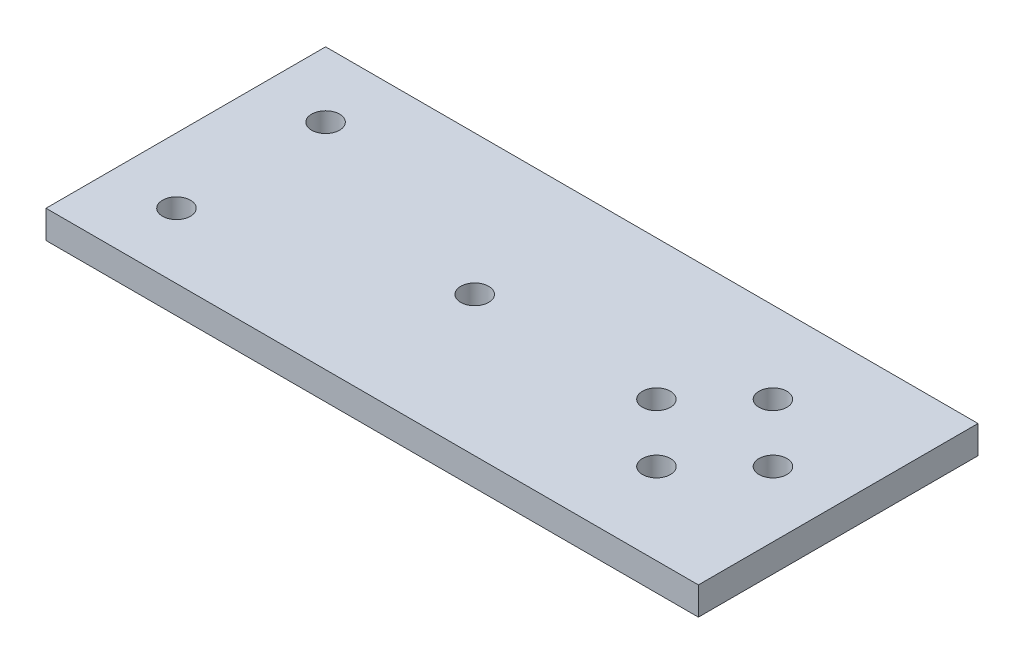
ISO-10303-21;
HEADER;
FILE_DESCRIPTION(('STEP AP214'),'2;1');
FILE_NAME('part.step','',(''),(''),'','','');
FILE_SCHEMA(('AUTOMOTIVE_DESIGN { 1 0 10303 214 1 1 1 1 }'));
ENDSEC;
DATA;
#1=APPLICATION_CONTEXT('core data for automotive mechanical design processes');
#2=APPLICATION_PROTOCOL_DEFINITION('international standard','automotive_design',2000,#1);
#3=PRODUCT_CONTEXT('',#1,'mechanical');
#4=PRODUCT('Part','Part','',(#3));
#5=PRODUCT_RELATED_PRODUCT_CATEGORY('part','',(#4));
#6=PRODUCT_DEFINITION_FORMATION('','',#4);
#7=PRODUCT_DEFINITION_CONTEXT('part definition',#1,'design');
#8=PRODUCT_DEFINITION('design','',#6,#7);
#9=PRODUCT_DEFINITION_SHAPE('','',#8);
#10=(LENGTH_UNIT() NAMED_UNIT(*) SI_UNIT(.MILLI.,.METRE.));
#11=(NAMED_UNIT(*) PLANE_ANGLE_UNIT() SI_UNIT($,.RADIAN.));
#12=(NAMED_UNIT(*) SI_UNIT($,.STERADIAN.) SOLID_ANGLE_UNIT());
#13=UNCERTAINTY_MEASURE_WITH_UNIT(LENGTH_MEASURE(1.E-05),#10,'distance_accuracy_value','');
#14=(GEOMETRIC_REPRESENTATION_CONTEXT(3) GLOBAL_UNCERTAINTY_ASSIGNED_CONTEXT((#13)) GLOBAL_UNIT_ASSIGNED_CONTEXT((#10,
#11,#12)) REPRESENTATION_CONTEXT('',''));
#15=CARTESIAN_POINT('',(0.,0.,0.));
#16=DIRECTION('',(0.,0.,1.));
#17=DIRECTION('',(1.,0.,0.));
#18=AXIS2_PLACEMENT_3D('',#15,#16,#17);
#19=CARTESIAN_POINT('',(35.,-3.,-15.));
#20=DIRECTION('',(1.,0.,0.));
#21=DIRECTION('',(0.,0.,-1.));
#22=AXIS2_PLACEMENT_3D('',#19,#20,#21);
#23=PLANE('',#22);
#24=DIRECTION('',(0.,0.,-1.));
#25=VECTOR('',#24,1.);
#26=CARTESIAN_POINT('',(35.,0.,-15.));
#27=LINE('',#26,#25);
#28=CARTESIAN_POINT('',(35.,0.,15.));
#29=VERTEX_POINT('',#28);
#30=CARTESIAN_POINT('',(35.,0.,-15.));
#31=VERTEX_POINT('',#30);
#32=EDGE_CURVE('E103',#29,#31,#27,.T.);
#33=ORIENTED_EDGE('',*,*,#32,.F.);
#34=DIRECTION('',(0.,1.,0.));
#35=VECTOR('',#34,1.);
#36=CARTESIAN_POINT('',(35.,-3.,15.));
#37=LINE('',#36,#35);
#38=CARTESIAN_POINT('',(35.,-3.,15.));
#39=VERTEX_POINT('',#38);
#40=EDGE_CURVE('E11',#39,#29,#37,.T.);
#41=ORIENTED_EDGE('',*,*,#40,.F.);
#42=DIRECTION('',(0.,0.,-1.));
#43=VECTOR('',#42,1.);
#44=CARTESIAN_POINT('',(35.,-3.,-15.));
#45=LINE('',#44,#43);
#46=CARTESIAN_POINT('',(35.,-3.,-15.));
#47=VERTEX_POINT('',#46);
#48=EDGE_CURVE('E96',#39,#47,#45,.T.);
#49=ORIENTED_EDGE('',*,*,#48,.T.);
#50=DIRECTION('',(0.,1.,0.));
#51=VECTOR('',#50,1.);
#52=CARTESIAN_POINT('',(35.,-3.,-15.));
#53=LINE('',#52,#51);
#54=EDGE_CURVE('E41',#47,#31,#53,.T.);
#55=ORIENTED_EDGE('',*,*,#54,.T.);
#56=EDGE_LOOP('',(#33,#41,#49,#55));
#57=FACE_BOUND('',#56,.T.);
#58=ADVANCED_FACE('F38',(#57),#23,.T.);
#59=CARTESIAN_POINT('',(-35.,-3.,15.));
#60=DIRECTION('',(0.,0.,1.));
#61=DIRECTION('',(1.,0.,0.));
#62=AXIS2_PLACEMENT_3D('',#59,#60,#61);
#63=PLANE('',#62);
#64=DIRECTION('',(1.,0.,0.));
#65=VECTOR('',#64,1.);
#66=CARTESIAN_POINT('',(-35.,0.,15.));
#67=LINE('',#66,#65);
#68=CARTESIAN_POINT('',(-35.,0.,15.));
#69=VERTEX_POINT('',#68);
#70=EDGE_CURVE('E98',#69,#29,#67,.T.);
#71=ORIENTED_EDGE('',*,*,#70,.F.);
#72=DIRECTION('',(0.,1.,0.));
#73=VECTOR('',#72,1.);
#74=CARTESIAN_POINT('',(-35.,-3.,15.));
#75=LINE('',#74,#73);
#76=CARTESIAN_POINT('',(-35.,-3.,15.));
#77=VERTEX_POINT('',#76);
#78=EDGE_CURVE('E47',#77,#69,#75,.T.);
#79=ORIENTED_EDGE('',*,*,#78,.F.);
#80=DIRECTION('',(1.,0.,0.));
#81=VECTOR('',#80,1.);
#82=CARTESIAN_POINT('',(-35.,-3.,15.));
#83=LINE('',#82,#81);
#84=EDGE_CURVE('E93',#77,#39,#83,.T.);
#85=ORIENTED_EDGE('',*,*,#84,.T.);
#86=ORIENTED_EDGE('',*,*,#40,.T.);
#87=EDGE_LOOP('',(#71,#79,#85,#86));
#88=FACE_BOUND('',#87,.T.);
#89=ADVANCED_FACE('F114',(#88),#63,.T.);
#90=CARTESIAN_POINT('',(-35.,-3.,-15.));
#91=DIRECTION('',(-1.,0.,0.));
#92=DIRECTION('',(0.,0.,1.));
#93=AXIS2_PLACEMENT_3D('',#90,#91,#92);
#94=PLANE('',#93);
#95=DIRECTION('',(0.,0.,1.));
#96=VECTOR('',#95,1.);
#97=CARTESIAN_POINT('',(-35.,0.,-15.));
#98=LINE('',#97,#96);
#99=CARTESIAN_POINT('',(-35.,0.,-15.));
#100=VERTEX_POINT('',#99);
#101=EDGE_CURVE('E88',#100,#69,#98,.T.);
#102=ORIENTED_EDGE('',*,*,#101,.F.);
#103=DIRECTION('',(0.,1.,0.));
#104=VECTOR('',#103,1.);
#105=CARTESIAN_POINT('',(-35.,-3.,-15.));
#106=LINE('',#105,#104);
#107=CARTESIAN_POINT('',(-35.,-3.,-15.));
#108=VERTEX_POINT('',#107);
#109=EDGE_CURVE('E83',#108,#100,#106,.T.);
#110=ORIENTED_EDGE('',*,*,#109,.F.);
#111=DIRECTION('',(0.,0.,1.));
#112=VECTOR('',#111,1.);
#113=CARTESIAN_POINT('',(-35.,-3.,-15.));
#114=LINE('',#113,#112);
#115=EDGE_CURVE('E86',#108,#77,#114,.T.);
#116=ORIENTED_EDGE('',*,*,#115,.T.);
#117=ORIENTED_EDGE('',*,*,#78,.T.);
#118=EDGE_LOOP('',(#102,#110,#116,#117));
#119=FACE_BOUND('',#118,.T.);
#120=ADVANCED_FACE('F85',(#119),#94,.T.);
#121=CARTESIAN_POINT('',(-35.,-3.,-15.));
#122=DIRECTION('',(0.,0.,-1.));
#123=DIRECTION('',(-1.,0.,0.));
#124=AXIS2_PLACEMENT_3D('',#121,#122,#123);
#125=PLANE('',#124);
#126=DIRECTION('',(-1.,0.,0.));
#127=VECTOR('',#126,1.);
#128=CARTESIAN_POINT('',(-35.,0.,-15.));
#129=LINE('',#128,#127);
#130=EDGE_CURVE('E106',#31,#100,#129,.T.);
#131=ORIENTED_EDGE('',*,*,#130,.F.);
#132=ORIENTED_EDGE('',*,*,#54,.F.);
#133=DIRECTION('',(-1.,0.,0.));
#134=VECTOR('',#133,1.);
#135=CARTESIAN_POINT('',(-35.,-3.,-15.));
#136=LINE('',#135,#134);
#137=EDGE_CURVE('E92',#47,#108,#136,.T.);
#138=ORIENTED_EDGE('',*,*,#137,.T.);
#139=ORIENTED_EDGE('',*,*,#109,.T.);
#140=EDGE_LOOP('',(#131,#132,#138,#139));
#141=FACE_BOUND('',#140,.T.);
#142=ADVANCED_FACE('F95',(#141),#125,.T.);
#143=CARTESIAN_POINT('',(0.,-3.,0.));
#144=DIRECTION('',(0.,1.,0.));
#145=DIRECTION('',(0.,0.,1.));
#146=AXIS2_PLACEMENT_3D('',#143,#144,#145);
#147=PLANE('',#146);
#148=CARTESIAN_POINT('',(-4.,-3.,0.));
#149=DIRECTION('',(0.,1.,0.));
#150=DIRECTION('',(0.,0.,1.));
#151=AXIS2_PLACEMENT_3D('',#148,#149,#150);
#152=CIRCLE('',#151,1.5);
#153=CARTESIAN_POINT('',(-4.,-3.,1.5));
#154=VERTEX_POINT('',#153);
#155=EDGE_CURVE('E171',#154,#154,#152,.F.);
#156=ORIENTED_EDGE('',*,*,#155,.F.);
#157=EDGE_LOOP('',(#156));
#158=FACE_BOUND('',#157,.T.);
#159=CARTESIAN_POINT('',(15.5,-3.,0.));
#160=DIRECTION('',(0.,1.,0.));
#161=DIRECTION('',(0.,0.,1.));
#162=AXIS2_PLACEMENT_3D('',#159,#160,#161);
#163=CIRCLE('',#162,1.5);
#164=CARTESIAN_POINT('',(15.5,-3.,1.5));
#165=VERTEX_POINT('',#164);
#166=EDGE_CURVE('E182',#165,#165,#163,.F.);
#167=ORIENTED_EDGE('',*,*,#166,.F.);
#168=EDGE_LOOP('',(#167));
#169=FACE_BOUND('',#168,.T.);
#170=CARTESIAN_POINT('',(21.75,-3.,-6.25));
#171=DIRECTION('',(0.,1.,0.));
#172=DIRECTION('',(0.,0.,1.));
#173=AXIS2_PLACEMENT_3D('',#170,#171,#172);
#174=CIRCLE('',#173,1.5);
#175=CARTESIAN_POINT('',(21.75,-3.,-4.75));
#176=VERTEX_POINT('',#175);
#177=EDGE_CURVE('E183',#176,#176,#174,.F.);
#178=ORIENTED_EDGE('',*,*,#177,.F.);
#179=EDGE_LOOP('',(#178));
#180=FACE_BOUND('',#179,.T.);
#181=CARTESIAN_POINT('',(21.75,-3.,6.25));
#182=DIRECTION('',(0.,1.,0.));
#183=DIRECTION('',(0.,0.,1.));
#184=AXIS2_PLACEMENT_3D('',#181,#182,#183);
#185=CIRCLE('',#184,1.5);
#186=CARTESIAN_POINT('',(21.75,-3.,7.75));
#187=VERTEX_POINT('',#186);
#188=EDGE_CURVE('E175',#187,#187,#185,.F.);
#189=ORIENTED_EDGE('',*,*,#188,.F.);
#190=EDGE_LOOP('',(#189));
#191=FACE_BOUND('',#190,.T.);
#192=CARTESIAN_POINT('',(28.,-3.,0.));
#193=DIRECTION('',(0.,1.,0.));
#194=DIRECTION('',(0.,0.,1.));
#195=AXIS2_PLACEMENT_3D('',#192,#193,#194);
#196=CIRCLE('',#195,1.5);
#197=CARTESIAN_POINT('',(28.,-3.,1.5));
#198=VERTEX_POINT('',#197);
#199=EDGE_CURVE('E196',#198,#198,#196,.F.);
#200=ORIENTED_EDGE('',*,*,#199,.F.);
#201=EDGE_LOOP('',(#200));
#202=FACE_BOUND('',#201,.T.);
#203=CARTESIAN_POINT('',(-28.,-3.,8.));
#204=DIRECTION('',(0.,1.,0.));
#205=DIRECTION('',(0.,0.,1.));
#206=AXIS2_PLACEMENT_3D('',#203,#204,#205);
#207=CIRCLE('',#206,1.5);
#208=CARTESIAN_POINT('',(-28.,-3.,9.5));
#209=VERTEX_POINT('',#208);
#210=EDGE_CURVE('E199',#209,#209,#207,.T.);
#211=ORIENTED_EDGE('',*,*,#210,.T.);
#212=EDGE_LOOP('',(#211));
#213=FACE_BOUND('',#212,.T.);
#214=CARTESIAN_POINT('',(-28.,-3.,-8.));
#215=DIRECTION('',(0.,1.,0.));
#216=DIRECTION('',(0.,0.,1.));
#217=AXIS2_PLACEMENT_3D('',#214,#215,#216);
#218=CIRCLE('',#217,1.5);
#219=CARTESIAN_POINT('',(-28.,-3.,-6.5));
#220=VERTEX_POINT('',#219);
#221=EDGE_CURVE('E107',#220,#220,#218,.F.);
#222=ORIENTED_EDGE('',*,*,#221,.F.);
#223=EDGE_LOOP('',(#222));
#224=FACE_BOUND('',#223,.T.);
#225=ORIENTED_EDGE('',*,*,#48,.F.);
#226=ORIENTED_EDGE('',*,*,#84,.F.);
#227=ORIENTED_EDGE('',*,*,#115,.F.);
#228=ORIENTED_EDGE('',*,*,#137,.F.);
#229=EDGE_LOOP('',(#225,#226,#227,#228));
#230=FACE_BOUND('',#229,.T.);
#231=ADVANCED_FACE('F91',(#158,#169,#180,#191,#202,#213,#224,#230),#147,.F.);
#232=CARTESIAN_POINT('',(0.,0.,0.));
#233=DIRECTION('',(0.,1.,0.));
#234=DIRECTION('',(0.,0.,1.));
#235=AXIS2_PLACEMENT_3D('',#232,#233,#234);
#236=PLANE('',#235);
#237=CARTESIAN_POINT('',(-4.,0.,0.));
#238=DIRECTION('',(0.,1.,0.));
#239=DIRECTION('',(0.,0.,1.));
#240=AXIS2_PLACEMENT_3D('',#237,#238,#239);
#241=CIRCLE('',#240,1.5);
#242=CARTESIAN_POINT('',(-4.,0.,1.5));
#243=VERTEX_POINT('',#242);
#244=EDGE_CURVE('E169',#243,#243,#241,.T.);
#245=ORIENTED_EDGE('',*,*,#244,.F.);
#246=EDGE_LOOP('',(#245));
#247=FACE_BOUND('',#246,.T.);
#248=CARTESIAN_POINT('',(15.5,0.,0.));
#249=DIRECTION('',(0.,1.,0.));
#250=DIRECTION('',(0.,0.,1.));
#251=AXIS2_PLACEMENT_3D('',#248,#249,#250);
#252=CIRCLE('',#251,1.5);
#253=CARTESIAN_POINT('',(15.5,0.,1.5));
#254=VERTEX_POINT('',#253);
#255=EDGE_CURVE('E179',#254,#254,#252,.T.);
#256=ORIENTED_EDGE('',*,*,#255,.F.);
#257=EDGE_LOOP('',(#256));
#258=FACE_BOUND('',#257,.T.);
#259=CARTESIAN_POINT('',(21.75,0.,-6.25));
#260=DIRECTION('',(0.,1.,0.));
#261=DIRECTION('',(0.,0.,1.));
#262=AXIS2_PLACEMENT_3D('',#259,#260,#261);
#263=CIRCLE('',#262,1.5);
#264=CARTESIAN_POINT('',(21.75,0.,-4.75));
#265=VERTEX_POINT('',#264);
#266=EDGE_CURVE('E187',#265,#265,#263,.T.);
#267=ORIENTED_EDGE('',*,*,#266,.F.);
#268=EDGE_LOOP('',(#267));
#269=FACE_BOUND('',#268,.T.);
#270=CARTESIAN_POINT('',(21.75,0.,6.25));
#271=DIRECTION('',(0.,1.,0.));
#272=DIRECTION('',(0.,0.,1.));
#273=AXIS2_PLACEMENT_3D('',#270,#271,#272);
#274=CIRCLE('',#273,1.5);
#275=CARTESIAN_POINT('',(21.75,0.,7.75));
#276=VERTEX_POINT('',#275);
#277=EDGE_CURVE('E172',#276,#276,#274,.T.);
#278=ORIENTED_EDGE('',*,*,#277,.F.);
#279=EDGE_LOOP('',(#278));
#280=FACE_BOUND('',#279,.T.);
#281=CARTESIAN_POINT('',(28.,0.,0.));
#282=DIRECTION('',(0.,1.,0.));
#283=DIRECTION('',(0.,0.,1.));
#284=AXIS2_PLACEMENT_3D('',#281,#282,#283);
#285=CIRCLE('',#284,1.5);
#286=CARTESIAN_POINT('',(28.,0.,1.5));
#287=VERTEX_POINT('',#286);
#288=EDGE_CURVE('E186',#287,#287,#285,.T.);
#289=ORIENTED_EDGE('',*,*,#288,.F.);
#290=EDGE_LOOP('',(#289));
#291=FACE_BOUND('',#290,.T.);
#292=CARTESIAN_POINT('',(-28.,0.,8.));
#293=DIRECTION('',(0.,-1.,0.));
#294=DIRECTION('',(0.,0.,-1.));
#295=AXIS2_PLACEMENT_3D('',#292,#293,#294);
#296=CIRCLE('',#295,1.5);
#297=CARTESIAN_POINT('',(-28.,0.,9.5));
#298=VERTEX_POINT('',#297);
#299=EDGE_CURVE('E200',#298,#298,#296,.T.);
#300=ORIENTED_EDGE('',*,*,#299,.T.);
#301=EDGE_LOOP('',(#300));
#302=FACE_BOUND('',#301,.T.);
#303=CARTESIAN_POINT('',(-28.,0.,-8.));
#304=DIRECTION('',(0.,1.,0.));
#305=DIRECTION('',(0.,0.,1.));
#306=AXIS2_PLACEMENT_3D('',#303,#304,#305);
#307=CIRCLE('',#306,1.5);
#308=CARTESIAN_POINT('',(-28.,0.,-6.5));
#309=VERTEX_POINT('',#308);
#310=EDGE_CURVE('E203',#309,#309,#307,.T.);
#311=ORIENTED_EDGE('',*,*,#310,.F.);
#312=EDGE_LOOP('',(#311));
#313=FACE_BOUND('',#312,.T.);
#314=ORIENTED_EDGE('',*,*,#32,.T.);
#315=ORIENTED_EDGE('',*,*,#130,.T.);
#316=ORIENTED_EDGE('',*,*,#101,.T.);
#317=ORIENTED_EDGE('',*,*,#70,.T.);
#318=EDGE_LOOP('',(#314,#315,#316,#317));
#319=FACE_BOUND('',#318,.T.);
#320=ADVANCED_FACE('F113',(#247,#258,#269,#280,#291,#302,#313,#319),#236,.T.);
#321=CARTESIAN_POINT('',(-28.,-3.001,-8.));
#322=DIRECTION('',(0.,1.,0.));
#323=DIRECTION('',(0.,0.,1.));
#324=AXIS2_PLACEMENT_3D('',#321,#322,#323);
#325=CYLINDRICAL_SURFACE('',#324,1.5);
#326=CARTESIAN_POINT('',(-28.,0.,-6.5));
#327=CARTESIAN_POINT('',(-28.,-0.0312500000000005,-6.5));
#328=CARTESIAN_POINT('',(-28.,-0.0625000000000005,-6.5));
#329=CARTESIAN_POINT('',(-28.,-0.125000000000001,-6.5));
#330=CARTESIAN_POINT('',(-28.,-0.156250000000001,-6.5));
#331=CARTESIAN_POINT('',(-28.,-0.218750000000001,-6.5));
#332=CARTESIAN_POINT('',(-28.,-0.250000000000001,-6.5));
#333=CARTESIAN_POINT('',(-28.,-0.312500000000001,-6.5));
#334=CARTESIAN_POINT('',(-28.,-0.34375,-6.5));
#335=CARTESIAN_POINT('',(-28.,-0.40625,-6.5));
#336=CARTESIAN_POINT('',(-28.,-0.4375,-6.5));
#337=CARTESIAN_POINT('',(-28.,-0.5,-6.5));
#338=CARTESIAN_POINT('',(-28.,-0.53125,-6.5));
#339=CARTESIAN_POINT('',(-28.,-0.593750000000001,-6.5));
#340=CARTESIAN_POINT('',(-28.,-0.625000000000001,-6.5));
#341=CARTESIAN_POINT('',(-28.,-0.687500000000001,-6.5));
#342=CARTESIAN_POINT('',(-28.,-0.71875,-6.5));
#343=CARTESIAN_POINT('',(-28.,-0.78125,-6.5));
#344=CARTESIAN_POINT('',(-28.,-0.8125,-6.5));
#345=CARTESIAN_POINT('',(-28.,-0.875,-6.5));
#346=CARTESIAN_POINT('',(-28.,-0.90625,-6.5));
#347=CARTESIAN_POINT('',(-28.,-0.96875,-6.5));
#348=CARTESIAN_POINT('',(-28.,-1.,-6.5));
#349=CARTESIAN_POINT('',(-28.,-1.0625,-6.5));
#350=CARTESIAN_POINT('',(-28.,-1.09375,-6.5));
#351=CARTESIAN_POINT('',(-28.,-1.15625,-6.5));
#352=CARTESIAN_POINT('',(-28.,-1.1875,-6.5));
#353=CARTESIAN_POINT('',(-28.,-1.25,-6.5));
#354=CARTESIAN_POINT('',(-28.,-1.28125,-6.5));
#355=CARTESIAN_POINT('',(-28.,-1.34375,-6.5));
#356=CARTESIAN_POINT('',(-28.,-1.375,-6.5));
#357=CARTESIAN_POINT('',(-28.,-1.4375,-6.5));
#358=CARTESIAN_POINT('',(-28.,-1.46875,-6.5));
#359=CARTESIAN_POINT('',(-28.,-1.53125,-6.5));
#360=CARTESIAN_POINT('',(-28.,-1.5625,-6.5));
#361=CARTESIAN_POINT('',(-28.,-1.625,-6.5));
#362=CARTESIAN_POINT('',(-28.,-1.65625,-6.5));
#363=CARTESIAN_POINT('',(-28.,-1.71875,-6.5));
#364=CARTESIAN_POINT('',(-28.,-1.75,-6.5));
#365=CARTESIAN_POINT('',(-28.,-1.8125,-6.5));
#366=CARTESIAN_POINT('',(-28.,-1.84375,-6.5));
#367=CARTESIAN_POINT('',(-28.,-1.90625,-6.5));
#368=CARTESIAN_POINT('',(-28.,-1.9375,-6.5));
#369=CARTESIAN_POINT('',(-28.,-2.,-6.5));
#370=CARTESIAN_POINT('',(-28.,-2.03125,-6.5));
#371=CARTESIAN_POINT('',(-28.,-2.09375,-6.5));
#372=CARTESIAN_POINT('',(-28.,-2.125,-6.5));
#373=CARTESIAN_POINT('',(-28.,-2.1875,-6.5));
#374=CARTESIAN_POINT('',(-28.,-2.21875,-6.5));
#375=CARTESIAN_POINT('',(-28.,-2.28125,-6.5));
#376=CARTESIAN_POINT('',(-28.,-2.3125,-6.5));
#377=CARTESIAN_POINT('',(-28.,-2.375,-6.5));
#378=CARTESIAN_POINT('',(-28.,-2.40625,-6.5));
#379=CARTESIAN_POINT('',(-28.,-2.46875,-6.5));
#380=CARTESIAN_POINT('',(-28.,-2.5,-6.5));
#381=CARTESIAN_POINT('',(-28.,-2.5625,-6.5));
#382=CARTESIAN_POINT('',(-28.,-2.59375,-6.5));
#383=CARTESIAN_POINT('',(-28.,-2.65625,-6.5));
#384=CARTESIAN_POINT('',(-28.,-2.6875,-6.5));
#385=CARTESIAN_POINT('',(-28.,-2.75,-6.5));
#386=CARTESIAN_POINT('',(-28.,-2.78125,-6.5));
#387=CARTESIAN_POINT('',(-28.,-2.84375,-6.5));
#388=CARTESIAN_POINT('',(-28.,-2.875,-6.5));
#389=CARTESIAN_POINT('',(-28.,-2.9375,-6.5));
#390=CARTESIAN_POINT('',(-28.,-2.96875,-6.5));
#391=CARTESIAN_POINT('',(-28.,-3.,-6.5));
#392=B_SPLINE_CURVE_WITH_KNOTS('',3,(#326,#327,#328,#329,#330,#331,#332,#333,#334,#335,#336,
#337,#338,#339,#340,#341,#342,#343,#344,#345,#346,#347,#348,#349,#350,#351,#352,#353,#354,#355,
#356,#357,#358,#359,#360,#361,#362,#363,#364,#365,#366,#367,#368,#369,#370,#371,#372,#373,#374,
#375,#376,#377,#378,#379,#380,#381,#382,#383,#384,#385,#386,#387,#388,#389,#390,#391),
.UNSPECIFIED.,.F.,.F.,(4,2,2,2,2,2,2,2,2,2,2,2,2,2,2,2,2,2,2,2,2,2,2,2,2,2,2,2,2,2,2,2,4),(0.,
0.0937500000000001,0.1875,0.28125,0.375,0.46875,0.5625,0.65625,0.75,0.84375,0.9375,1.03125,
1.125,1.21875,1.3125,1.40625,1.5,1.59375,1.6875,1.78125,1.875,1.96875,2.0625,2.15625,2.25,
2.34375,2.4375,2.53125,2.625,2.71875,2.8125,2.90625,3.),.UNSPECIFIED.);
#393=EDGE_CURVE('BSEAM133',#309,#220,#392,.T.);
#394=ORIENTED_EDGE('',*,*,#310,.T.);
#395=ORIENTED_EDGE('',*,*,#221,.T.);
#396=ORIENTED_EDGE('',*,*,#393,.T.);
#397=ORIENTED_EDGE('',*,*,#393,.F.);
#398=EDGE_LOOP('',(#394,#396,#395,#397));
#399=FACE_BOUND('',#398,.T.);
#400=ADVANCED_FACE('F133',(#399),#325,.F.);
#401=CARTESIAN_POINT('',(-28.,-3.001,8.));
#402=DIRECTION('',(0.,1.,0.));
#403=DIRECTION('',(0.,0.,1.));
#404=AXIS2_PLACEMENT_3D('',#401,#402,#403);
#405=CYLINDRICAL_SURFACE('',#404,1.5);
#406=CARTESIAN_POINT('',(-28.,0.,9.5));
#407=CARTESIAN_POINT('',(-28.,-0.0312499999999996,9.5));
#408=CARTESIAN_POINT('',(-28.,-0.0624999999999996,9.5));
#409=CARTESIAN_POINT('',(-28.,-0.125,9.5));
#410=CARTESIAN_POINT('',(-28.,-0.15625,9.5));
#411=CARTESIAN_POINT('',(-28.,-0.21875,9.5));
#412=CARTESIAN_POINT('',(-28.,-0.25,9.5));
#413=CARTESIAN_POINT('',(-28.,-0.3125,9.5));
#414=CARTESIAN_POINT('',(-28.,-0.34375,9.5));
#415=CARTESIAN_POINT('',(-28.,-0.40625,9.5));
#416=CARTESIAN_POINT('',(-28.,-0.4375,9.5));
#417=CARTESIAN_POINT('',(-28.,-0.5,9.5));
#418=CARTESIAN_POINT('',(-28.,-0.53125,9.5));
#419=CARTESIAN_POINT('',(-28.,-0.59375,9.5));
#420=CARTESIAN_POINT('',(-28.,-0.625,9.5));
#421=CARTESIAN_POINT('',(-28.,-0.6875,9.5));
#422=CARTESIAN_POINT('',(-28.,-0.71875,9.5));
#423=CARTESIAN_POINT('',(-28.,-0.78125,9.5));
#424=CARTESIAN_POINT('',(-28.,-0.8125,9.5));
#425=CARTESIAN_POINT('',(-28.,-0.875,9.5));
#426=CARTESIAN_POINT('',(-28.,-0.90625,9.5));
#427=CARTESIAN_POINT('',(-28.,-0.96875,9.5));
#428=CARTESIAN_POINT('',(-28.,-1.,9.5));
#429=CARTESIAN_POINT('',(-28.,-1.0625,9.5));
#430=CARTESIAN_POINT('',(-28.,-1.09375,9.5));
#431=CARTESIAN_POINT('',(-28.,-1.15625,9.5));
#432=CARTESIAN_POINT('',(-28.,-1.1875,9.5));
#433=CARTESIAN_POINT('',(-28.,-1.25,9.5));
#434=CARTESIAN_POINT('',(-28.,-1.28125,9.5));
#435=CARTESIAN_POINT('',(-28.,-1.34375,9.5));
#436=CARTESIAN_POINT('',(-28.,-1.375,9.5));
#437=CARTESIAN_POINT('',(-28.,-1.4375,9.5));
#438=CARTESIAN_POINT('',(-28.,-1.46875,9.5));
#439=CARTESIAN_POINT('',(-28.,-1.53125,9.5));
#440=CARTESIAN_POINT('',(-28.,-1.5625,9.5));
#441=CARTESIAN_POINT('',(-28.,-1.625,9.5));
#442=CARTESIAN_POINT('',(-28.,-1.65625,9.5));
#443=CARTESIAN_POINT('',(-28.,-1.71875,9.5));
#444=CARTESIAN_POINT('',(-28.,-1.75,9.5));
#445=CARTESIAN_POINT('',(-28.,-1.8125,9.5));
#446=CARTESIAN_POINT('',(-28.,-1.84375,9.5));
#447=CARTESIAN_POINT('',(-28.,-1.90625,9.5));
#448=CARTESIAN_POINT('',(-28.,-1.9375,9.5));
#449=CARTESIAN_POINT('',(-28.,-2.,9.5));
#450=CARTESIAN_POINT('',(-28.,-2.03125,9.5));
#451=CARTESIAN_POINT('',(-28.,-2.09375,9.5));
#452=CARTESIAN_POINT('',(-28.,-2.125,9.5));
#453=CARTESIAN_POINT('',(-28.,-2.1875,9.5));
#454=CARTESIAN_POINT('',(-28.,-2.21875,9.5));
#455=CARTESIAN_POINT('',(-28.,-2.28125,9.5));
#456=CARTESIAN_POINT('',(-28.,-2.3125,9.5));
#457=CARTESIAN_POINT('',(-28.,-2.375,9.5));
#458=CARTESIAN_POINT('',(-28.,-2.40625,9.5));
#459=CARTESIAN_POINT('',(-28.,-2.46875,9.5));
#460=CARTESIAN_POINT('',(-28.,-2.5,9.5));
#461=CARTESIAN_POINT('',(-28.,-2.5625,9.5));
#462=CARTESIAN_POINT('',(-28.,-2.59375,9.5));
#463=CARTESIAN_POINT('',(-28.,-2.65625,9.5));
#464=CARTESIAN_POINT('',(-28.,-2.6875,9.5));
#465=CARTESIAN_POINT('',(-28.,-2.75,9.5));
#466=CARTESIAN_POINT('',(-28.,-2.78125,9.5));
#467=CARTESIAN_POINT('',(-28.,-2.84375,9.5));
#468=CARTESIAN_POINT('',(-28.,-2.875,9.5));
#469=CARTESIAN_POINT('',(-28.,-2.9375,9.5));
#470=CARTESIAN_POINT('',(-28.,-2.96875,9.5));
#471=CARTESIAN_POINT('',(-28.,-3.,9.5));
#472=B_SPLINE_CURVE_WITH_KNOTS('',3,(#406,#407,#408,#409,#410,#411,#412,#413,#414,#415,#416,
#417,#418,#419,#420,#421,#422,#423,#424,#425,#426,#427,#428,#429,#430,#431,#432,#433,#434,#435,
#436,#437,#438,#439,#440,#441,#442,#443,#444,#445,#446,#447,#448,#449,#450,#451,#452,#453,#454,
#455,#456,#457,#458,#459,#460,#461,#462,#463,#464,#465,#466,#467,#468,#469,#470,#471),
.UNSPECIFIED.,.F.,.F.,(4,2,2,2,2,2,2,2,2,2,2,2,2,2,2,2,2,2,2,2,2,2,2,2,2,2,2,2,2,2,2,2,4),(0.,
0.0937500000000001,0.1875,0.28125,0.375,0.46875,0.5625,0.65625,0.75,0.84375,0.9375,1.03125,
1.125,1.21875,1.3125,1.40625,1.5,1.59375,1.6875,1.78125,1.875,1.96875,2.0625,2.15625,2.25,
2.34375,2.4375,2.53125,2.625,2.71875,2.8125,2.90625,3.),.UNSPECIFIED.);
#473=EDGE_CURVE('BSEAM140',#298,#209,#472,.T.);
#474=ORIENTED_EDGE('',*,*,#299,.F.);
#475=ORIENTED_EDGE('',*,*,#210,.F.);
#476=ORIENTED_EDGE('',*,*,#473,.T.);
#477=ORIENTED_EDGE('',*,*,#473,.F.);
#478=EDGE_LOOP('',(#474,#476,#475,#477));
#479=FACE_BOUND('',#478,.T.);
#480=ADVANCED_FACE('F140',(#479),#405,.F.);
#481=CARTESIAN_POINT('',(28.,-3.001,0.));
#482=DIRECTION('',(0.,1.,0.));
#483=DIRECTION('',(0.,0.,1.));
#484=AXIS2_PLACEMENT_3D('',#481,#482,#483);
#485=CYLINDRICAL_SURFACE('',#484,1.5);
#486=CARTESIAN_POINT('',(28.,0.,1.5));
#487=CARTESIAN_POINT('',(28.,-0.0312500000000005,1.5));
#488=CARTESIAN_POINT('',(28.,-0.0625000000000005,1.5));
#489=CARTESIAN_POINT('',(28.,-0.125000000000001,1.5));
#490=CARTESIAN_POINT('',(28.,-0.156250000000001,1.5));
#491=CARTESIAN_POINT('',(28.,-0.218750000000001,1.5));
#492=CARTESIAN_POINT('',(28.,-0.250000000000001,1.5));
#493=CARTESIAN_POINT('',(28.,-0.312500000000001,1.5));
#494=CARTESIAN_POINT('',(28.,-0.34375,1.5));
#495=CARTESIAN_POINT('',(28.,-0.40625,1.5));
#496=CARTESIAN_POINT('',(28.,-0.4375,1.5));
#497=CARTESIAN_POINT('',(28.,-0.5,1.5));
#498=CARTESIAN_POINT('',(28.,-0.53125,1.5));
#499=CARTESIAN_POINT('',(28.,-0.593750000000001,1.5));
#500=CARTESIAN_POINT('',(28.,-0.625000000000001,1.5));
#501=CARTESIAN_POINT('',(28.,-0.687500000000001,1.5));
#502=CARTESIAN_POINT('',(28.,-0.71875,1.5));
#503=CARTESIAN_POINT('',(28.,-0.78125,1.5));
#504=CARTESIAN_POINT('',(28.,-0.8125,1.5));
#505=CARTESIAN_POINT('',(28.,-0.875,1.5));
#506=CARTESIAN_POINT('',(28.,-0.90625,1.5));
#507=CARTESIAN_POINT('',(28.,-0.96875,1.5));
#508=CARTESIAN_POINT('',(28.,-1.,1.5));
#509=CARTESIAN_POINT('',(28.,-1.0625,1.5));
#510=CARTESIAN_POINT('',(28.,-1.09375,1.5));
#511=CARTESIAN_POINT('',(28.,-1.15625,1.5));
#512=CARTESIAN_POINT('',(28.,-1.1875,1.5));
#513=CARTESIAN_POINT('',(28.,-1.25,1.5));
#514=CARTESIAN_POINT('',(28.,-1.28125,1.5));
#515=CARTESIAN_POINT('',(28.,-1.34375,1.5));
#516=CARTESIAN_POINT('',(28.,-1.375,1.5));
#517=CARTESIAN_POINT('',(28.,-1.4375,1.5));
#518=CARTESIAN_POINT('',(28.,-1.46875,1.5));
#519=CARTESIAN_POINT('',(28.,-1.53125,1.5));
#520=CARTESIAN_POINT('',(28.,-1.5625,1.5));
#521=CARTESIAN_POINT('',(28.,-1.625,1.5));
#522=CARTESIAN_POINT('',(28.,-1.65625,1.5));
#523=CARTESIAN_POINT('',(28.,-1.71875,1.5));
#524=CARTESIAN_POINT('',(28.,-1.75,1.5));
#525=CARTESIAN_POINT('',(28.,-1.8125,1.5));
#526=CARTESIAN_POINT('',(28.,-1.84375,1.5));
#527=CARTESIAN_POINT('',(28.,-1.90625,1.5));
#528=CARTESIAN_POINT('',(28.,-1.9375,1.5));
#529=CARTESIAN_POINT('',(28.,-2.,1.5));
#530=CARTESIAN_POINT('',(28.,-2.03125,1.5));
#531=CARTESIAN_POINT('',(28.,-2.09375,1.5));
#532=CARTESIAN_POINT('',(28.,-2.125,1.5));
#533=CARTESIAN_POINT('',(28.,-2.1875,1.5));
#534=CARTESIAN_POINT('',(28.,-2.21875,1.5));
#535=CARTESIAN_POINT('',(28.,-2.28125,1.5));
#536=CARTESIAN_POINT('',(28.,-2.3125,1.5));
#537=CARTESIAN_POINT('',(28.,-2.375,1.5));
#538=CARTESIAN_POINT('',(28.,-2.40625,1.5));
#539=CARTESIAN_POINT('',(28.,-2.46875,1.5));
#540=CARTESIAN_POINT('',(28.,-2.5,1.5));
#541=CARTESIAN_POINT('',(28.,-2.5625,1.5));
#542=CARTESIAN_POINT('',(28.,-2.59375,1.5));
#543=CARTESIAN_POINT('',(28.,-2.65625,1.5));
#544=CARTESIAN_POINT('',(28.,-2.6875,1.5));
#545=CARTESIAN_POINT('',(28.,-2.75,1.5));
#546=CARTESIAN_POINT('',(28.,-2.78125,1.5));
#547=CARTESIAN_POINT('',(28.,-2.84375,1.5));
#548=CARTESIAN_POINT('',(28.,-2.875,1.5));
#549=CARTESIAN_POINT('',(28.,-2.9375,1.5));
#550=CARTESIAN_POINT('',(28.,-2.96875,1.5));
#551=CARTESIAN_POINT('',(28.,-3.,1.5));
#552=B_SPLINE_CURVE_WITH_KNOTS('',3,(#486,#487,#488,#489,#490,#491,#492,#493,#494,#495,#496,
#497,#498,#499,#500,#501,#502,#503,#504,#505,#506,#507,#508,#509,#510,#511,#512,#513,#514,#515,
#516,#517,#518,#519,#520,#521,#522,#523,#524,#525,#526,#527,#528,#529,#530,#531,#532,#533,#534,
#535,#536,#537,#538,#539,#540,#541,#542,#543,#544,#545,#546,#547,#548,#549,#550,#551),
.UNSPECIFIED.,.F.,.F.,(4,2,2,2,2,2,2,2,2,2,2,2,2,2,2,2,2,2,2,2,2,2,2,2,2,2,2,2,2,2,2,2,4),(0.,
0.0937500000000001,0.1875,0.28125,0.375,0.46875,0.5625,0.65625,0.75,0.84375,0.9375,1.03125,
1.125,1.21875,1.3125,1.40625,1.5,1.59375,1.6875,1.78125,1.875,1.96875,2.0625,2.15625,2.25,
2.34375,2.4375,2.53125,2.625,2.71875,2.8125,2.90625,3.),.UNSPECIFIED.);
#553=EDGE_CURVE('BSEAM144',#287,#198,#552,.T.);
#554=ORIENTED_EDGE('',*,*,#288,.T.);
#555=ORIENTED_EDGE('',*,*,#199,.T.);
#556=ORIENTED_EDGE('',*,*,#553,.T.);
#557=ORIENTED_EDGE('',*,*,#553,.F.);
#558=EDGE_LOOP('',(#554,#556,#555,#557));
#559=FACE_BOUND('',#558,.T.);
#560=ADVANCED_FACE('F144',(#559),#485,.F.);
#561=CARTESIAN_POINT('',(21.75,-3.001,6.25));
#562=DIRECTION('',(0.,1.,0.));
#563=DIRECTION('',(0.,0.,1.));
#564=AXIS2_PLACEMENT_3D('',#561,#562,#563);
#565=CYLINDRICAL_SURFACE('',#564,1.5);
#566=CARTESIAN_POINT('',(21.75,0.,7.75));
#567=CARTESIAN_POINT('',(21.75,-0.0312500000000005,7.75));
#568=CARTESIAN_POINT('',(21.75,-0.0625000000000005,7.75));
#569=CARTESIAN_POINT('',(21.75,-0.125000000000001,7.75));
#570=CARTESIAN_POINT('',(21.75,-0.156250000000001,7.75));
#571=CARTESIAN_POINT('',(21.75,-0.218750000000001,7.75));
#572=CARTESIAN_POINT('',(21.75,-0.250000000000001,7.75));
#573=CARTESIAN_POINT('',(21.75,-0.312500000000001,7.75));
#574=CARTESIAN_POINT('',(21.75,-0.34375,7.75));
#575=CARTESIAN_POINT('',(21.75,-0.40625,7.75));
#576=CARTESIAN_POINT('',(21.75,-0.4375,7.75));
#577=CARTESIAN_POINT('',(21.75,-0.5,7.75));
#578=CARTESIAN_POINT('',(21.75,-0.53125,7.75));
#579=CARTESIAN_POINT('',(21.75,-0.593750000000001,7.75));
#580=CARTESIAN_POINT('',(21.75,-0.625000000000001,7.75));
#581=CARTESIAN_POINT('',(21.75,-0.687500000000001,7.75));
#582=CARTESIAN_POINT('',(21.75,-0.71875,7.75));
#583=CARTESIAN_POINT('',(21.75,-0.78125,7.75));
#584=CARTESIAN_POINT('',(21.75,-0.8125,7.75));
#585=CARTESIAN_POINT('',(21.75,-0.875,7.75));
#586=CARTESIAN_POINT('',(21.75,-0.90625,7.75));
#587=CARTESIAN_POINT('',(21.75,-0.96875,7.75));
#588=CARTESIAN_POINT('',(21.75,-1.,7.75));
#589=CARTESIAN_POINT('',(21.75,-1.0625,7.75));
#590=CARTESIAN_POINT('',(21.75,-1.09375,7.75));
#591=CARTESIAN_POINT('',(21.75,-1.15625,7.75));
#592=CARTESIAN_POINT('',(21.75,-1.1875,7.75));
#593=CARTESIAN_POINT('',(21.75,-1.25,7.75));
#594=CARTESIAN_POINT('',(21.75,-1.28125,7.75));
#595=CARTESIAN_POINT('',(21.75,-1.34375,7.75));
#596=CARTESIAN_POINT('',(21.75,-1.375,7.75));
#597=CARTESIAN_POINT('',(21.75,-1.4375,7.75));
#598=CARTESIAN_POINT('',(21.75,-1.46875,7.75));
#599=CARTESIAN_POINT('',(21.75,-1.53125,7.75));
#600=CARTESIAN_POINT('',(21.75,-1.5625,7.75));
#601=CARTESIAN_POINT('',(21.75,-1.625,7.75));
#602=CARTESIAN_POINT('',(21.75,-1.65625,7.75));
#603=CARTESIAN_POINT('',(21.75,-1.71875,7.75));
#604=CARTESIAN_POINT('',(21.75,-1.75,7.75));
#605=CARTESIAN_POINT('',(21.75,-1.8125,7.75));
#606=CARTESIAN_POINT('',(21.75,-1.84375,7.75));
#607=CARTESIAN_POINT('',(21.75,-1.90625,7.75));
#608=CARTESIAN_POINT('',(21.75,-1.9375,7.75));
#609=CARTESIAN_POINT('',(21.75,-2.,7.75));
#610=CARTESIAN_POINT('',(21.75,-2.03125,7.75));
#611=CARTESIAN_POINT('',(21.75,-2.09375,7.75));
#612=CARTESIAN_POINT('',(21.75,-2.125,7.75));
#613=CARTESIAN_POINT('',(21.75,-2.1875,7.75));
#614=CARTESIAN_POINT('',(21.75,-2.21875,7.75));
#615=CARTESIAN_POINT('',(21.75,-2.28125,7.75));
#616=CARTESIAN_POINT('',(21.75,-2.3125,7.75));
#617=CARTESIAN_POINT('',(21.75,-2.375,7.75));
#618=CARTESIAN_POINT('',(21.75,-2.40625,7.75));
#619=CARTESIAN_POINT('',(21.75,-2.46875,7.75));
#620=CARTESIAN_POINT('',(21.75,-2.5,7.75));
#621=CARTESIAN_POINT('',(21.75,-2.5625,7.75));
#622=CARTESIAN_POINT('',(21.75,-2.59375,7.75));
#623=CARTESIAN_POINT('',(21.75,-2.65625,7.75));
#624=CARTESIAN_POINT('',(21.75,-2.6875,7.75));
#625=CARTESIAN_POINT('',(21.75,-2.75,7.75));
#626=CARTESIAN_POINT('',(21.75,-2.78125,7.75));
#627=CARTESIAN_POINT('',(21.75,-2.84375,7.75));
#628=CARTESIAN_POINT('',(21.75,-2.875,7.75));
#629=CARTESIAN_POINT('',(21.75,-2.9375,7.75));
#630=CARTESIAN_POINT('',(21.75,-2.96875,7.75));
#631=CARTESIAN_POINT('',(21.75,-3.,7.75));
#632=B_SPLINE_CURVE_WITH_KNOTS('',3,(#566,#567,#568,#569,#570,#571,#572,#573,#574,#575,#576,
#577,#578,#579,#580,#581,#582,#583,#584,#585,#586,#587,#588,#589,#590,#591,#592,#593,#594,#595,
#596,#597,#598,#599,#600,#601,#602,#603,#604,#605,#606,#607,#608,#609,#610,#611,#612,#613,#614,
#615,#616,#617,#618,#619,#620,#621,#622,#623,#624,#625,#626,#627,#628,#629,#630,#631),
.UNSPECIFIED.,.F.,.F.,(4,2,2,2,2,2,2,2,2,2,2,2,2,2,2,2,2,2,2,2,2,2,2,2,2,2,2,2,2,2,2,2,4),(0.,
0.0937500000000001,0.1875,0.28125,0.375,0.46875,0.5625,0.65625,0.75,0.84375,0.9375,1.03125,
1.125,1.21875,1.3125,1.40625,1.5,1.59375,1.6875,1.78125,1.875,1.96875,2.0625,2.15625,2.25,
2.34375,2.4375,2.53125,2.625,2.71875,2.8125,2.90625,3.),.UNSPECIFIED.);
#633=EDGE_CURVE('BSEAM148',#276,#187,#632,.T.);
#634=ORIENTED_EDGE('',*,*,#277,.T.);
#635=ORIENTED_EDGE('',*,*,#188,.T.);
#636=ORIENTED_EDGE('',*,*,#633,.T.);
#637=ORIENTED_EDGE('',*,*,#633,.F.);
#638=EDGE_LOOP('',(#634,#636,#635,#637));
#639=FACE_BOUND('',#638,.T.);
#640=ADVANCED_FACE('F148',(#639),#565,.F.);
#641=CARTESIAN_POINT('',(21.75,-3.001,-6.25));
#642=DIRECTION('',(0.,1.,0.));
#643=DIRECTION('',(0.,0.,1.));
#644=AXIS2_PLACEMENT_3D('',#641,#642,#643);
#645=CYLINDRICAL_SURFACE('',#644,1.5);
#646=CARTESIAN_POINT('',(21.75,0.,-4.75));
#647=CARTESIAN_POINT('',(21.75,-0.0312500000000005,-4.75));
#648=CARTESIAN_POINT('',(21.75,-0.0625000000000005,-4.75));
#649=CARTESIAN_POINT('',(21.75,-0.125000000000001,-4.75));
#650=CARTESIAN_POINT('',(21.75,-0.156250000000001,-4.75));
#651=CARTESIAN_POINT('',(21.75,-0.218750000000001,-4.75));
#652=CARTESIAN_POINT('',(21.75,-0.250000000000001,-4.75));
#653=CARTESIAN_POINT('',(21.75,-0.312500000000001,-4.75));
#654=CARTESIAN_POINT('',(21.75,-0.34375,-4.75));
#655=CARTESIAN_POINT('',(21.75,-0.40625,-4.75));
#656=CARTESIAN_POINT('',(21.75,-0.4375,-4.75));
#657=CARTESIAN_POINT('',(21.75,-0.5,-4.75));
#658=CARTESIAN_POINT('',(21.75,-0.53125,-4.75));
#659=CARTESIAN_POINT('',(21.75,-0.593750000000001,-4.75));
#660=CARTESIAN_POINT('',(21.75,-0.625000000000001,-4.75));
#661=CARTESIAN_POINT('',(21.75,-0.687500000000001,-4.75));
#662=CARTESIAN_POINT('',(21.75,-0.71875,-4.75));
#663=CARTESIAN_POINT('',(21.75,-0.78125,-4.75));
#664=CARTESIAN_POINT('',(21.75,-0.8125,-4.75));
#665=CARTESIAN_POINT('',(21.75,-0.875,-4.75));
#666=CARTESIAN_POINT('',(21.75,-0.90625,-4.75));
#667=CARTESIAN_POINT('',(21.75,-0.96875,-4.75));
#668=CARTESIAN_POINT('',(21.75,-1.,-4.75));
#669=CARTESIAN_POINT('',(21.75,-1.0625,-4.75));
#670=CARTESIAN_POINT('',(21.75,-1.09375,-4.75));
#671=CARTESIAN_POINT('',(21.75,-1.15625,-4.75));
#672=CARTESIAN_POINT('',(21.75,-1.1875,-4.75));
#673=CARTESIAN_POINT('',(21.75,-1.25,-4.75));
#674=CARTESIAN_POINT('',(21.75,-1.28125,-4.75));
#675=CARTESIAN_POINT('',(21.75,-1.34375,-4.75));
#676=CARTESIAN_POINT('',(21.75,-1.375,-4.75));
#677=CARTESIAN_POINT('',(21.75,-1.4375,-4.75));
#678=CARTESIAN_POINT('',(21.75,-1.46875,-4.75));
#679=CARTESIAN_POINT('',(21.75,-1.53125,-4.75));
#680=CARTESIAN_POINT('',(21.75,-1.5625,-4.75));
#681=CARTESIAN_POINT('',(21.75,-1.625,-4.75));
#682=CARTESIAN_POINT('',(21.75,-1.65625,-4.75));
#683=CARTESIAN_POINT('',(21.75,-1.71875,-4.75));
#684=CARTESIAN_POINT('',(21.75,-1.75,-4.75));
#685=CARTESIAN_POINT('',(21.75,-1.8125,-4.75));
#686=CARTESIAN_POINT('',(21.75,-1.84375,-4.75));
#687=CARTESIAN_POINT('',(21.75,-1.90625,-4.75));
#688=CARTESIAN_POINT('',(21.75,-1.9375,-4.75));
#689=CARTESIAN_POINT('',(21.75,-2.,-4.75));
#690=CARTESIAN_POINT('',(21.75,-2.03125,-4.75));
#691=CARTESIAN_POINT('',(21.75,-2.09375,-4.75));
#692=CARTESIAN_POINT('',(21.75,-2.125,-4.75));
#693=CARTESIAN_POINT('',(21.75,-2.1875,-4.75));
#694=CARTESIAN_POINT('',(21.75,-2.21875,-4.75));
#695=CARTESIAN_POINT('',(21.75,-2.28125,-4.75));
#696=CARTESIAN_POINT('',(21.75,-2.3125,-4.75));
#697=CARTESIAN_POINT('',(21.75,-2.375,-4.75));
#698=CARTESIAN_POINT('',(21.75,-2.40625,-4.75));
#699=CARTESIAN_POINT('',(21.75,-2.46875,-4.75));
#700=CARTESIAN_POINT('',(21.75,-2.5,-4.75));
#701=CARTESIAN_POINT('',(21.75,-2.5625,-4.75));
#702=CARTESIAN_POINT('',(21.75,-2.59375,-4.75));
#703=CARTESIAN_POINT('',(21.75,-2.65625,-4.75));
#704=CARTESIAN_POINT('',(21.75,-2.6875,-4.75));
#705=CARTESIAN_POINT('',(21.75,-2.75,-4.75));
#706=CARTESIAN_POINT('',(21.75,-2.78125,-4.75));
#707=CARTESIAN_POINT('',(21.75,-2.84375,-4.75));
#708=CARTESIAN_POINT('',(21.75,-2.875,-4.75));
#709=CARTESIAN_POINT('',(21.75,-2.9375,-4.75));
#710=CARTESIAN_POINT('',(21.75,-2.96875,-4.75));
#711=CARTESIAN_POINT('',(21.75,-3.,-4.75));
#712=B_SPLINE_CURVE_WITH_KNOTS('',3,(#646,#647,#648,#649,#650,#651,#652,#653,#654,#655,#656,
#657,#658,#659,#660,#661,#662,#663,#664,#665,#666,#667,#668,#669,#670,#671,#672,#673,#674,#675,
#676,#677,#678,#679,#680,#681,#682,#683,#684,#685,#686,#687,#688,#689,#690,#691,#692,#693,#694,
#695,#696,#697,#698,#699,#700,#701,#702,#703,#704,#705,#706,#707,#708,#709,#710,#711),
.UNSPECIFIED.,.F.,.F.,(4,2,2,2,2,2,2,2,2,2,2,2,2,2,2,2,2,2,2,2,2,2,2,2,2,2,2,2,2,2,2,2,4),(0.,
0.0937500000000001,0.1875,0.28125,0.375,0.46875,0.5625,0.65625,0.75,0.84375,0.9375,1.03125,
1.125,1.21875,1.3125,1.40625,1.5,1.59375,1.6875,1.78125,1.875,1.96875,2.0625,2.15625,2.25,
2.34375,2.4375,2.53125,2.625,2.71875,2.8125,2.90625,3.),.UNSPECIFIED.);
#713=EDGE_CURVE('BSEAM152',#265,#176,#712,.T.);
#714=ORIENTED_EDGE('',*,*,#266,.T.);
#715=ORIENTED_EDGE('',*,*,#177,.T.);
#716=ORIENTED_EDGE('',*,*,#713,.T.);
#717=ORIENTED_EDGE('',*,*,#713,.F.);
#718=EDGE_LOOP('',(#714,#716,#715,#717));
#719=FACE_BOUND('',#718,.T.);
#720=ADVANCED_FACE('F152',(#719),#645,.F.);
#721=CARTESIAN_POINT('',(15.5,-3.001,0.));
#722=DIRECTION('',(0.,1.,0.));
#723=DIRECTION('',(0.,0.,1.));
#724=AXIS2_PLACEMENT_3D('',#721,#722,#723);
#725=CYLINDRICAL_SURFACE('',#724,1.5);
#726=CARTESIAN_POINT('',(15.5,0.,1.5));
#727=CARTESIAN_POINT('',(15.5,-0.0312500000000005,1.5));
#728=CARTESIAN_POINT('',(15.5,-0.0625000000000005,1.5));
#729=CARTESIAN_POINT('',(15.5,-0.125000000000001,1.5));
#730=CARTESIAN_POINT('',(15.5,-0.156250000000001,1.5));
#731=CARTESIAN_POINT('',(15.5,-0.218750000000001,1.5));
#732=CARTESIAN_POINT('',(15.5,-0.250000000000001,1.5));
#733=CARTESIAN_POINT('',(15.5,-0.312500000000001,1.5));
#734=CARTESIAN_POINT('',(15.5,-0.34375,1.5));
#735=CARTESIAN_POINT('',(15.5,-0.40625,1.5));
#736=CARTESIAN_POINT('',(15.5,-0.4375,1.5));
#737=CARTESIAN_POINT('',(15.5,-0.5,1.5));
#738=CARTESIAN_POINT('',(15.5,-0.53125,1.5));
#739=CARTESIAN_POINT('',(15.5,-0.593750000000001,1.5));
#740=CARTESIAN_POINT('',(15.5,-0.625000000000001,1.5));
#741=CARTESIAN_POINT('',(15.5,-0.687500000000001,1.5));
#742=CARTESIAN_POINT('',(15.5,-0.71875,1.5));
#743=CARTESIAN_POINT('',(15.5,-0.78125,1.5));
#744=CARTESIAN_POINT('',(15.5,-0.8125,1.5));
#745=CARTESIAN_POINT('',(15.5,-0.875,1.5));
#746=CARTESIAN_POINT('',(15.5,-0.90625,1.5));
#747=CARTESIAN_POINT('',(15.5,-0.96875,1.5));
#748=CARTESIAN_POINT('',(15.5,-1.,1.5));
#749=CARTESIAN_POINT('',(15.5,-1.0625,1.5));
#750=CARTESIAN_POINT('',(15.5,-1.09375,1.5));
#751=CARTESIAN_POINT('',(15.5,-1.15625,1.5));
#752=CARTESIAN_POINT('',(15.5,-1.1875,1.5));
#753=CARTESIAN_POINT('',(15.5,-1.25,1.5));
#754=CARTESIAN_POINT('',(15.5,-1.28125,1.5));
#755=CARTESIAN_POINT('',(15.5,-1.34375,1.5));
#756=CARTESIAN_POINT('',(15.5,-1.375,1.5));
#757=CARTESIAN_POINT('',(15.5,-1.4375,1.5));
#758=CARTESIAN_POINT('',(15.5,-1.46875,1.5));
#759=CARTESIAN_POINT('',(15.5,-1.53125,1.5));
#760=CARTESIAN_POINT('',(15.5,-1.5625,1.5));
#761=CARTESIAN_POINT('',(15.5,-1.625,1.5));
#762=CARTESIAN_POINT('',(15.5,-1.65625,1.5));
#763=CARTESIAN_POINT('',(15.5,-1.71875,1.5));
#764=CARTESIAN_POINT('',(15.5,-1.75,1.5));
#765=CARTESIAN_POINT('',(15.5,-1.8125,1.5));
#766=CARTESIAN_POINT('',(15.5,-1.84375,1.5));
#767=CARTESIAN_POINT('',(15.5,-1.90625,1.5));
#768=CARTESIAN_POINT('',(15.5,-1.9375,1.5));
#769=CARTESIAN_POINT('',(15.5,-2.,1.5));
#770=CARTESIAN_POINT('',(15.5,-2.03125,1.5));
#771=CARTESIAN_POINT('',(15.5,-2.09375,1.5));
#772=CARTESIAN_POINT('',(15.5,-2.125,1.5));
#773=CARTESIAN_POINT('',(15.5,-2.1875,1.5));
#774=CARTESIAN_POINT('',(15.5,-2.21875,1.5));
#775=CARTESIAN_POINT('',(15.5,-2.28125,1.5));
#776=CARTESIAN_POINT('',(15.5,-2.3125,1.5));
#777=CARTESIAN_POINT('',(15.5,-2.375,1.5));
#778=CARTESIAN_POINT('',(15.5,-2.40625,1.5));
#779=CARTESIAN_POINT('',(15.5,-2.46875,1.5));
#780=CARTESIAN_POINT('',(15.5,-2.5,1.5));
#781=CARTESIAN_POINT('',(15.5,-2.5625,1.5));
#782=CARTESIAN_POINT('',(15.5,-2.59375,1.5));
#783=CARTESIAN_POINT('',(15.5,-2.65625,1.5));
#784=CARTESIAN_POINT('',(15.5,-2.6875,1.5));
#785=CARTESIAN_POINT('',(15.5,-2.75,1.5));
#786=CARTESIAN_POINT('',(15.5,-2.78125,1.5));
#787=CARTESIAN_POINT('',(15.5,-2.84375,1.5));
#788=CARTESIAN_POINT('',(15.5,-2.875,1.5));
#789=CARTESIAN_POINT('',(15.5,-2.9375,1.5));
#790=CARTESIAN_POINT('',(15.5,-2.96875,1.5));
#791=CARTESIAN_POINT('',(15.5,-3.,1.5));
#792=B_SPLINE_CURVE_WITH_KNOTS('',3,(#726,#727,#728,#729,#730,#731,#732,#733,#734,#735,#736,
#737,#738,#739,#740,#741,#742,#743,#744,#745,#746,#747,#748,#749,#750,#751,#752,#753,#754,#755,
#756,#757,#758,#759,#760,#761,#762,#763,#764,#765,#766,#767,#768,#769,#770,#771,#772,#773,#774,
#775,#776,#777,#778,#779,#780,#781,#782,#783,#784,#785,#786,#787,#788,#789,#790,#791),
.UNSPECIFIED.,.F.,.F.,(4,2,2,2,2,2,2,2,2,2,2,2,2,2,2,2,2,2,2,2,2,2,2,2,2,2,2,2,2,2,2,2,4),(0.,
0.0937500000000001,0.1875,0.28125,0.375,0.46875,0.5625,0.65625,0.75,0.84375,0.9375,1.03125,
1.125,1.21875,1.3125,1.40625,1.5,1.59375,1.6875,1.78125,1.875,1.96875,2.0625,2.15625,2.25,
2.34375,2.4375,2.53125,2.625,2.71875,2.8125,2.90625,3.),.UNSPECIFIED.);
#793=EDGE_CURVE('BSEAM156',#254,#165,#792,.T.);
#794=ORIENTED_EDGE('',*,*,#255,.T.);
#795=ORIENTED_EDGE('',*,*,#166,.T.);
#796=ORIENTED_EDGE('',*,*,#793,.T.);
#797=ORIENTED_EDGE('',*,*,#793,.F.);
#798=EDGE_LOOP('',(#794,#796,#795,#797));
#799=FACE_BOUND('',#798,.T.);
#800=ADVANCED_FACE('F156',(#799),#725,.F.);
#801=CARTESIAN_POINT('',(-4.,-3.001,0.));
#802=DIRECTION('',(0.,1.,0.));
#803=DIRECTION('',(0.,0.,1.));
#804=AXIS2_PLACEMENT_3D('',#801,#802,#803);
#805=CYLINDRICAL_SURFACE('',#804,1.5);
#806=CARTESIAN_POINT('',(-4.,0.,1.5));
#807=CARTESIAN_POINT('',(-4.,-0.0312500000000005,1.5));
#808=CARTESIAN_POINT('',(-4.,-0.0625000000000005,1.5));
#809=CARTESIAN_POINT('',(-4.,-0.125000000000001,1.5));
#810=CARTESIAN_POINT('',(-4.,-0.156250000000001,1.5));
#811=CARTESIAN_POINT('',(-4.,-0.218750000000001,1.5));
#812=CARTESIAN_POINT('',(-4.,-0.250000000000001,1.5));
#813=CARTESIAN_POINT('',(-4.,-0.312500000000001,1.5));
#814=CARTESIAN_POINT('',(-4.,-0.34375,1.5));
#815=CARTESIAN_POINT('',(-4.,-0.40625,1.5));
#816=CARTESIAN_POINT('',(-4.,-0.4375,1.5));
#817=CARTESIAN_POINT('',(-4.,-0.5,1.5));
#818=CARTESIAN_POINT('',(-4.,-0.53125,1.5));
#819=CARTESIAN_POINT('',(-4.,-0.593750000000001,1.5));
#820=CARTESIAN_POINT('',(-4.,-0.625000000000001,1.5));
#821=CARTESIAN_POINT('',(-4.,-0.687500000000001,1.5));
#822=CARTESIAN_POINT('',(-4.,-0.71875,1.5));
#823=CARTESIAN_POINT('',(-4.,-0.78125,1.5));
#824=CARTESIAN_POINT('',(-4.,-0.8125,1.5));
#825=CARTESIAN_POINT('',(-4.,-0.875,1.5));
#826=CARTESIAN_POINT('',(-4.,-0.90625,1.5));
#827=CARTESIAN_POINT('',(-4.,-0.96875,1.5));
#828=CARTESIAN_POINT('',(-4.,-1.,1.5));
#829=CARTESIAN_POINT('',(-4.,-1.0625,1.5));
#830=CARTESIAN_POINT('',(-4.,-1.09375,1.5));
#831=CARTESIAN_POINT('',(-4.,-1.15625,1.5));
#832=CARTESIAN_POINT('',(-4.,-1.1875,1.5));
#833=CARTESIAN_POINT('',(-4.,-1.25,1.5));
#834=CARTESIAN_POINT('',(-4.,-1.28125,1.5));
#835=CARTESIAN_POINT('',(-4.,-1.34375,1.5));
#836=CARTESIAN_POINT('',(-4.,-1.375,1.5));
#837=CARTESIAN_POINT('',(-4.,-1.4375,1.5));
#838=CARTESIAN_POINT('',(-4.,-1.46875,1.5));
#839=CARTESIAN_POINT('',(-4.,-1.53125,1.5));
#840=CARTESIAN_POINT('',(-4.,-1.5625,1.5));
#841=CARTESIAN_POINT('',(-4.,-1.625,1.5));
#842=CARTESIAN_POINT('',(-4.,-1.65625,1.5));
#843=CARTESIAN_POINT('',(-4.,-1.71875,1.5));
#844=CARTESIAN_POINT('',(-4.,-1.75,1.5));
#845=CARTESIAN_POINT('',(-4.,-1.8125,1.5));
#846=CARTESIAN_POINT('',(-4.,-1.84375,1.5));
#847=CARTESIAN_POINT('',(-4.,-1.90625,1.5));
#848=CARTESIAN_POINT('',(-4.,-1.9375,1.5));
#849=CARTESIAN_POINT('',(-4.,-2.,1.5));
#850=CARTESIAN_POINT('',(-4.,-2.03125,1.5));
#851=CARTESIAN_POINT('',(-4.,-2.09375,1.5));
#852=CARTESIAN_POINT('',(-4.,-2.125,1.5));
#853=CARTESIAN_POINT('',(-4.,-2.1875,1.5));
#854=CARTESIAN_POINT('',(-4.,-2.21875,1.5));
#855=CARTESIAN_POINT('',(-4.,-2.28125,1.5));
#856=CARTESIAN_POINT('',(-4.,-2.3125,1.5));
#857=CARTESIAN_POINT('',(-4.,-2.375,1.5));
#858=CARTESIAN_POINT('',(-4.,-2.40625,1.5));
#859=CARTESIAN_POINT('',(-4.,-2.46875,1.5));
#860=CARTESIAN_POINT('',(-4.,-2.5,1.5));
#861=CARTESIAN_POINT('',(-4.,-2.5625,1.5));
#862=CARTESIAN_POINT('',(-4.,-2.59375,1.5));
#863=CARTESIAN_POINT('',(-4.,-2.65625,1.5));
#864=CARTESIAN_POINT('',(-4.,-2.6875,1.5));
#865=CARTESIAN_POINT('',(-4.,-2.75,1.5));
#866=CARTESIAN_POINT('',(-4.,-2.78125,1.5));
#867=CARTESIAN_POINT('',(-4.,-2.84375,1.5));
#868=CARTESIAN_POINT('',(-4.,-2.875,1.5));
#869=CARTESIAN_POINT('',(-4.,-2.9375,1.5));
#870=CARTESIAN_POINT('',(-4.,-2.96875,1.5));
#871=CARTESIAN_POINT('',(-4.,-3.,1.5));
#872=B_SPLINE_CURVE_WITH_KNOTS('',3,(#806,#807,#808,#809,#810,#811,#812,#813,#814,#815,#816,
#817,#818,#819,#820,#821,#822,#823,#824,#825,#826,#827,#828,#829,#830,#831,#832,#833,#834,#835,
#836,#837,#838,#839,#840,#841,#842,#843,#844,#845,#846,#847,#848,#849,#850,#851,#852,#853,#854,
#855,#856,#857,#858,#859,#860,#861,#862,#863,#864,#865,#866,#867,#868,#869,#870,#871),
.UNSPECIFIED.,.F.,.F.,(4,2,2,2,2,2,2,2,2,2,2,2,2,2,2,2,2,2,2,2,2,2,2,2,2,2,2,2,2,2,2,2,4),(0.,
0.0937500000000001,0.1875,0.28125,0.375,0.46875,0.5625,0.65625,0.75,0.84375,0.9375,1.03125,
1.125,1.21875,1.3125,1.40625,1.5,1.59375,1.6875,1.78125,1.875,1.96875,2.0625,2.15625,2.25,
2.34375,2.4375,2.53125,2.625,2.71875,2.8125,2.90625,3.),.UNSPECIFIED.);
#873=EDGE_CURVE('BSEAM160',#243,#154,#872,.T.);
#874=ORIENTED_EDGE('',*,*,#244,.T.);
#875=ORIENTED_EDGE('',*,*,#155,.T.);
#876=ORIENTED_EDGE('',*,*,#873,.T.);
#877=ORIENTED_EDGE('',*,*,#873,.F.);
#878=EDGE_LOOP('',(#874,#876,#875,#877));
#879=FACE_BOUND('',#878,.T.);
#880=ADVANCED_FACE('F160',(#879),#805,.F.);
#881=CLOSED_SHELL('',(#58,#89,#120,#142,#231,#320,#400,#480,#560,#640,#720,#800,#880));
#882=MANIFOLD_SOLID_BREP('B2',#881);
#883=ADVANCED_BREP_SHAPE_REPRESENTATION('',(#18,#882),#14);
#884=SHAPE_DEFINITION_REPRESENTATION(#9,#883);
ENDSEC;
END-ISO-10303-21;
